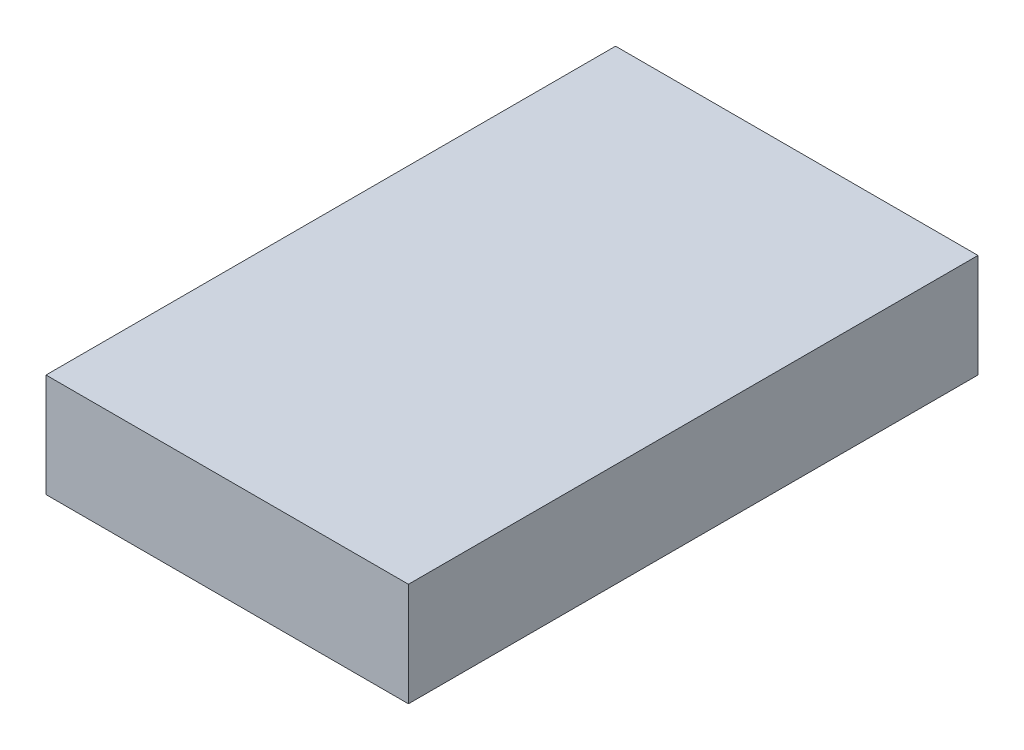
ISO-10303-21;
HEADER;
FILE_DESCRIPTION(('STEP AP214'),'2;1');
FILE_NAME('part.step','',(''),(''),'','','');
FILE_SCHEMA(('AUTOMOTIVE_DESIGN { 1 0 10303 214 1 1 1 1 }'));
ENDSEC;
DATA;
#1=APPLICATION_CONTEXT('core data for automotive mechanical design processes');
#2=APPLICATION_PROTOCOL_DEFINITION('international standard','automotive_design',2000,#1);
#3=PRODUCT_CONTEXT('',#1,'mechanical');
#4=PRODUCT('Part','Part','',(#3));
#5=PRODUCT_RELATED_PRODUCT_CATEGORY('part','',(#4));
#6=PRODUCT_DEFINITION_FORMATION('','',#4);
#7=PRODUCT_DEFINITION_CONTEXT('part definition',#1,'design');
#8=PRODUCT_DEFINITION('design','',#6,#7);
#9=PRODUCT_DEFINITION_SHAPE('','',#8);
#10=(LENGTH_UNIT() NAMED_UNIT(*) SI_UNIT(.MILLI.,.METRE.));
#11=(NAMED_UNIT(*) PLANE_ANGLE_UNIT() SI_UNIT($,.RADIAN.));
#12=(NAMED_UNIT(*) SI_UNIT($,.STERADIAN.) SOLID_ANGLE_UNIT());
#13=UNCERTAINTY_MEASURE_WITH_UNIT(LENGTH_MEASURE(1.E-05),#10,'distance_accuracy_value','');
#14=(GEOMETRIC_REPRESENTATION_CONTEXT(3) GLOBAL_UNCERTAINTY_ASSIGNED_CONTEXT((#13)) GLOBAL_UNIT_ASSIGNED_CONTEXT((#10,
#11,#12)) REPRESENTATION_CONTEXT('',''));
#15=CARTESIAN_POINT('',(0.,0.,0.));
#16=DIRECTION('',(0.,0.,1.));
#17=DIRECTION('',(1.,0.,0.));
#18=AXIS2_PLACEMENT_3D('',#15,#16,#17);
#19=CARTESIAN_POINT('',(22.225,6.35,34.925));
#20=DIRECTION('',(-1.,0.,0.));
#21=DIRECTION('',(0.,0.,1.));
#22=AXIS2_PLACEMENT_3D('',#19,#20,#21);
#23=PLANE('',#22);
#24=DIRECTION('',(0.,0.,-1.));
#25=VECTOR('',#24,1.);
#26=CARTESIAN_POINT('',(22.225,-6.35,34.925));
#27=LINE('',#26,#25);
#28=CARTESIAN_POINT('',(22.225,-6.35,34.925));
#29=VERTEX_POINT('',#28);
#30=CARTESIAN_POINT('',(22.225,-6.35,-34.925));
#31=VERTEX_POINT('',#30);
#32=EDGE_CURVE('E98',#29,#31,#27,.T.);
#33=ORIENTED_EDGE('',*,*,#32,.T.);
#34=DIRECTION('',(0.,-1.,0.));
#35=VECTOR('',#34,1.);
#36=CARTESIAN_POINT('',(22.225,6.35,-34.925));
#37=LINE('',#36,#35);
#38=CARTESIAN_POINT('',(22.225,6.35,-34.925));
#39=VERTEX_POINT('',#38);
#40=EDGE_CURVE('E11',#39,#31,#37,.T.);
#41=ORIENTED_EDGE('',*,*,#40,.F.);
#42=DIRECTION('',(0.,0.,-1.));
#43=VECTOR('',#42,1.);
#44=CARTESIAN_POINT('',(22.225,6.35,34.925));
#45=LINE('',#44,#43);
#46=CARTESIAN_POINT('',(22.225,6.35,34.925));
#47=VERTEX_POINT('',#46);
#48=EDGE_CURVE('E86',#47,#39,#45,.T.);
#49=ORIENTED_EDGE('',*,*,#48,.F.);
#50=DIRECTION('',(0.,-1.,0.));
#51=VECTOR('',#50,1.);
#52=CARTESIAN_POINT('',(22.225,6.35,34.925));
#53=LINE('',#52,#51);
#54=EDGE_CURVE('E94',#47,#29,#53,.T.);
#55=ORIENTED_EDGE('',*,*,#54,.T.);
#56=EDGE_LOOP('',(#33,#41,#49,#55));
#57=FACE_BOUND('',#56,.T.);
#58=ADVANCED_FACE('F35',(#57),#23,.F.);
#59=CARTESIAN_POINT('',(-22.225,6.35,-34.925));
#60=DIRECTION('',(0.,0.,1.));
#61=DIRECTION('',(1.,0.,0.));
#62=AXIS2_PLACEMENT_3D('',#59,#60,#61);
#63=PLANE('',#62);
#64=DIRECTION('',(-1.,0.,0.));
#65=VECTOR('',#64,1.);
#66=CARTESIAN_POINT('',(-22.225,-6.35,-34.925));
#67=LINE('',#66,#65);
#68=CARTESIAN_POINT('',(-22.225,-6.35,-34.925));
#69=VERTEX_POINT('',#68);
#70=EDGE_CURVE('E90',#31,#69,#67,.T.);
#71=ORIENTED_EDGE('',*,*,#70,.T.);
#72=DIRECTION('',(0.,-1.,0.));
#73=VECTOR('',#72,1.);
#74=CARTESIAN_POINT('',(-22.225,6.35,-34.925));
#75=LINE('',#74,#73);
#76=CARTESIAN_POINT('',(-22.225,6.35,-34.925));
#77=VERTEX_POINT('',#76);
#78=EDGE_CURVE('E43',#77,#69,#75,.T.);
#79=ORIENTED_EDGE('',*,*,#78,.F.);
#80=DIRECTION('',(-1.,0.,0.));
#81=VECTOR('',#80,1.);
#82=CARTESIAN_POINT('',(-22.225,6.35,-34.925));
#83=LINE('',#82,#81);
#84=EDGE_CURVE('E81',#39,#77,#83,.T.);
#85=ORIENTED_EDGE('',*,*,#84,.F.);
#86=ORIENTED_EDGE('',*,*,#40,.T.);
#87=EDGE_LOOP('',(#71,#79,#85,#86));
#88=FACE_BOUND('',#87,.T.);
#89=ADVANCED_FACE('F89',(#88),#63,.F.);
#90=CARTESIAN_POINT('',(-22.225,6.35,34.925));
#91=DIRECTION('',(1.,0.,0.));
#92=DIRECTION('',(0.,0.,-1.));
#93=AXIS2_PLACEMENT_3D('',#90,#91,#92);
#94=PLANE('',#93);
#95=DIRECTION('',(0.,0.,1.));
#96=VECTOR('',#95,1.);
#97=CARTESIAN_POINT('',(-22.225,-6.35,34.925));
#98=LINE('',#97,#96);
#99=CARTESIAN_POINT('',(-22.225,-6.35,34.925));
#100=VERTEX_POINT('',#99);
#101=EDGE_CURVE('E68',#69,#100,#98,.T.);
#102=ORIENTED_EDGE('',*,*,#101,.T.);
#103=DIRECTION('',(0.,-1.,0.));
#104=VECTOR('',#103,1.);
#105=CARTESIAN_POINT('',(-22.225,6.35,34.925));
#106=LINE('',#105,#104);
#107=CARTESIAN_POINT('',(-22.225,6.35,34.925));
#108=VERTEX_POINT('',#107);
#109=EDGE_CURVE('E91',#108,#100,#106,.T.);
#110=ORIENTED_EDGE('',*,*,#109,.F.);
#111=DIRECTION('',(0.,0.,1.));
#112=VECTOR('',#111,1.);
#113=CARTESIAN_POINT('',(-22.225,6.35,34.925));
#114=LINE('',#113,#112);
#115=EDGE_CURVE('E84',#77,#108,#114,.T.);
#116=ORIENTED_EDGE('',*,*,#115,.F.);
#117=ORIENTED_EDGE('',*,*,#78,.T.);
#118=EDGE_LOOP('',(#102,#110,#116,#117));
#119=FACE_BOUND('',#118,.T.);
#120=ADVANCED_FACE('F92',(#119),#94,.F.);
#121=CARTESIAN_POINT('',(-22.225,6.35,34.925));
#122=DIRECTION('',(0.,0.,-1.));
#123=DIRECTION('',(-1.,0.,0.));
#124=AXIS2_PLACEMENT_3D('',#121,#122,#123);
#125=PLANE('',#124);
#126=DIRECTION('',(1.,0.,0.));
#127=VECTOR('',#126,1.);
#128=CARTESIAN_POINT('',(-22.225,-6.35,34.925));
#129=LINE('',#128,#127);
#130=EDGE_CURVE('E74',#100,#29,#129,.T.);
#131=ORIENTED_EDGE('',*,*,#130,.T.);
#132=ORIENTED_EDGE('',*,*,#54,.F.);
#133=DIRECTION('',(1.,0.,0.));
#134=VECTOR('',#133,1.);
#135=CARTESIAN_POINT('',(-22.225,6.35,34.925));
#136=LINE('',#135,#134);
#137=EDGE_CURVE('E51',#108,#47,#136,.T.);
#138=ORIENTED_EDGE('',*,*,#137,.F.);
#139=ORIENTED_EDGE('',*,*,#109,.T.);
#140=EDGE_LOOP('',(#131,#132,#138,#139));
#141=FACE_BOUND('',#140,.T.);
#142=ADVANCED_FACE('F105',(#141),#125,.F.);
#143=CARTESIAN_POINT('',(0.,6.35,0.));
#144=DIRECTION('',(0.,-1.,0.));
#145=DIRECTION('',(0.,0.,-1.));
#146=AXIS2_PLACEMENT_3D('',#143,#144,#145);
#147=PLANE('',#146);
#148=ORIENTED_EDGE('',*,*,#48,.T.);
#149=ORIENTED_EDGE('',*,*,#84,.T.);
#150=ORIENTED_EDGE('',*,*,#115,.T.);
#151=ORIENTED_EDGE('',*,*,#137,.T.);
#152=EDGE_LOOP('',(#148,#149,#150,#151));
#153=FACE_BOUND('',#152,.T.);
#154=ADVANCED_FACE('F82',(#153),#147,.F.);
#155=CARTESIAN_POINT('',(0.,-6.35,0.));
#156=DIRECTION('',(0.,-1.,0.));
#157=DIRECTION('',(0.,0.,-1.));
#158=AXIS2_PLACEMENT_3D('',#155,#156,#157);
#159=PLANE('',#158);
#160=ORIENTED_EDGE('',*,*,#32,.F.);
#161=ORIENTED_EDGE('',*,*,#130,.F.);
#162=ORIENTED_EDGE('',*,*,#101,.F.);
#163=ORIENTED_EDGE('',*,*,#70,.F.);
#164=EDGE_LOOP('',(#160,#161,#162,#163));
#165=FACE_BOUND('',#164,.T.);
#166=ADVANCED_FACE('F108',(#165),#159,.T.);
#167=CLOSED_SHELL('',(#58,#89,#120,#142,#154,#166));
#168=MANIFOLD_SOLID_BREP('B2',#167);
#169=ADVANCED_BREP_SHAPE_REPRESENTATION('',(#18,#168),#14);
#170=SHAPE_DEFINITION_REPRESENTATION(#9,#169);
ENDSEC;
END-ISO-10303-21;
